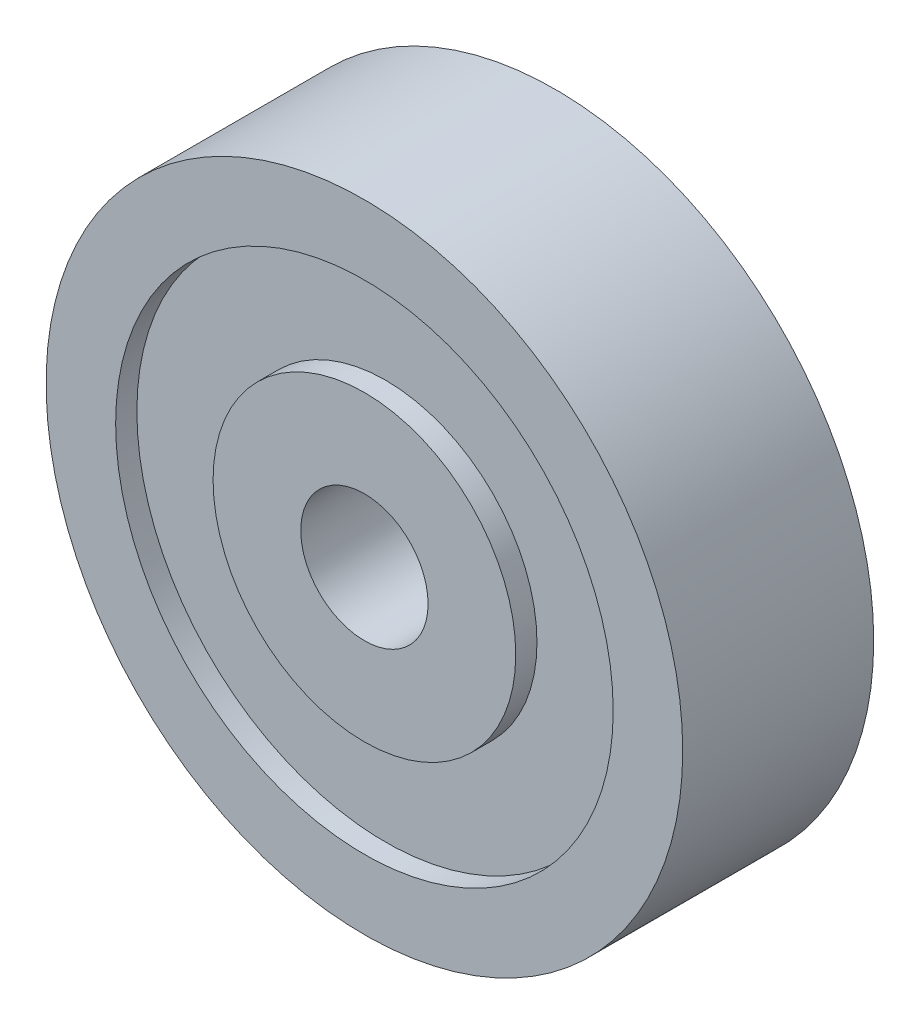
ISO-10303-21;
HEADER;
FILE_DESCRIPTION(('STEP AP214'),'2;1');
FILE_NAME('part.step','',(''),(''),'','','');
FILE_SCHEMA(('AUTOMOTIVE_DESIGN { 1 0 10303 214 1 1 1 1 }'));
ENDSEC;
DATA;
#1=APPLICATION_CONTEXT('core data for automotive mechanical design processes');
#2=APPLICATION_PROTOCOL_DEFINITION('international standard','automotive_design',2000,#1);
#3=PRODUCT_CONTEXT('',#1,'mechanical');
#4=PRODUCT('Part','Part','',(#3));
#5=PRODUCT_RELATED_PRODUCT_CATEGORY('part','',(#4));
#6=PRODUCT_DEFINITION_FORMATION('','',#4);
#7=PRODUCT_DEFINITION_CONTEXT('part definition',#1,'design');
#8=PRODUCT_DEFINITION('design','',#6,#7);
#9=PRODUCT_DEFINITION_SHAPE('','',#8);
#10=(LENGTH_UNIT() NAMED_UNIT(*) SI_UNIT(.MILLI.,.METRE.));
#11=(NAMED_UNIT(*) PLANE_ANGLE_UNIT() SI_UNIT($,.RADIAN.));
#12=(NAMED_UNIT(*) SI_UNIT($,.STERADIAN.) SOLID_ANGLE_UNIT());
#13=UNCERTAINTY_MEASURE_WITH_UNIT(LENGTH_MEASURE(1.E-05),#10,'distance_accuracy_value','');
#14=(GEOMETRIC_REPRESENTATION_CONTEXT(3) GLOBAL_UNCERTAINTY_ASSIGNED_CONTEXT((#13)) GLOBAL_UNIT_ASSIGNED_CONTEXT((#10,
#11,#12)) REPRESENTATION_CONTEXT('',''));
#15=CARTESIAN_POINT('',(0.,0.,0.));
#16=DIRECTION('',(0.,0.,1.));
#17=DIRECTION('',(1.,0.,0.));
#18=AXIS2_PLACEMENT_3D('',#15,#16,#17);
#19=CARTESIAN_POINT('',(0.,0.,9.));
#20=DIRECTION('',(0.,0.,1.));
#21=DIRECTION('',(1.,0.,0.));
#22=AXIS2_PLACEMENT_3D('',#19,#20,#21);
#23=PLANE('',#22);
#24=CARTESIAN_POINT('',(0.,0.,9.));
#25=DIRECTION('',(0.,0.,1.));
#26=DIRECTION('',(1.,0.,0.));
#27=AXIS2_PLACEMENT_3D('',#24,#25,#26);
#28=CIRCLE('',#27,3.);
#29=CARTESIAN_POINT('',(3.,0.,9.));
#30=VERTEX_POINT('',#29);
#31=EDGE_CURVE('E50',#30,#30,#28,.T.);
#32=ORIENTED_EDGE('',*,*,#31,.F.);
#33=EDGE_LOOP('',(#32));
#34=FACE_BOUND('',#33,.T.);
#35=CARTESIAN_POINT('',(0.,0.,9.));
#36=DIRECTION('',(0.,0.,-1.));
#37=DIRECTION('',(-1.,0.,0.));
#38=AXIS2_PLACEMENT_3D('',#35,#36,#37);
#39=CIRCLE('',#38,7.13156196506708);
#40=CARTESIAN_POINT('',(-7.13156196506708,0.,9.));
#41=VERTEX_POINT('',#40);
#42=EDGE_CURVE('E76',#41,#41,#39,.T.);
#43=ORIENTED_EDGE('',*,*,#42,.F.);
#44=EDGE_LOOP('',(#43));
#45=FACE_BOUND('',#44,.T.);
#46=ADVANCED_FACE('F39',(#34,#45),#23,.T.);
#47=CARTESIAN_POINT('',(0.,0.,0.));
#48=DIRECTION('',(0.,0.,1.));
#49=DIRECTION('',(1.,0.,0.));
#50=AXIS2_PLACEMENT_3D('',#47,#48,#49);
#51=PLANE('',#50);
#52=CARTESIAN_POINT('',(0.,0.,0.));
#53=DIRECTION('',(0.,0.,1.));
#54=DIRECTION('',(1.,0.,0.));
#55=AXIS2_PLACEMENT_3D('',#52,#53,#54);
#56=CIRCLE('',#55,3.);
#57=CARTESIAN_POINT('',(3.,0.,0.));
#58=VERTEX_POINT('',#57);
#59=EDGE_CURVE('E52',#58,#58,#56,.T.);
#60=ORIENTED_EDGE('',*,*,#59,.T.);
#61=EDGE_LOOP('',(#60));
#62=FACE_BOUND('',#61,.T.);
#63=CARTESIAN_POINT('',(0.,0.,0.));
#64=DIRECTION('',(0.,0.,-1.));
#65=DIRECTION('',(-1.,0.,0.));
#66=AXIS2_PLACEMENT_3D('',#63,#64,#65);
#67=CIRCLE('',#66,7.13156196506708);
#68=CARTESIAN_POINT('',(-7.13156196506708,0.,0.));
#69=VERTEX_POINT('',#68);
#70=EDGE_CURVE('E64',#69,#69,#67,.T.);
#71=ORIENTED_EDGE('',*,*,#70,.T.);
#72=EDGE_LOOP('',(#71));
#73=FACE_BOUND('',#72,.T.);
#74=ADVANCED_FACE('F92',(#62,#73),#51,.F.);
#75=CARTESIAN_POINT('',(0.,0.,9.));
#76=DIRECTION('',(0.,0.,-1.));
#77=DIRECTION('',(-1.,0.,0.));
#78=AXIS2_PLACEMENT_3D('',#75,#76,#77);
#79=CIRCLE('',#78,11.7231294362522);
#80=CARTESIAN_POINT('',(-11.7231294362522,0.,9.));
#81=VERTEX_POINT('',#80);
#82=EDGE_CURVE('E70',#81,#81,#79,.T.);
#83=ORIENTED_EDGE('',*,*,#82,.T.);
#84=EDGE_LOOP('',(#83));
#85=FACE_BOUND('',#84,.T.);
#86=CARTESIAN_POINT('',(0.,0.,9.));
#87=DIRECTION('',(0.,0.,1.));
#88=DIRECTION('',(1.,0.,0.));
#89=AXIS2_PLACEMENT_3D('',#86,#87,#88);
#90=CIRCLE('',#89,15.);
#91=CARTESIAN_POINT('',(15.,0.,9.));
#92=VERTEX_POINT('',#91);
#93=EDGE_CURVE('E10',#92,#92,#90,.T.);
#94=ORIENTED_EDGE('',*,*,#93,.T.);
#95=EDGE_LOOP('',(#94));
#96=FACE_BOUND('',#95,.T.);
#97=ADVANCED_FACE('F95',(#85,#96),#23,.T.);
#98=CARTESIAN_POINT('',(0.,0.,0.));
#99=DIRECTION('',(0.,0.,-1.));
#100=DIRECTION('',(-1.,0.,0.));
#101=AXIS2_PLACEMENT_3D('',#98,#99,#100);
#102=CIRCLE('',#101,11.7231294362522);
#103=CARTESIAN_POINT('',(-11.7231294362522,0.,0.));
#104=VERTEX_POINT('',#103);
#105=EDGE_CURVE('E58',#104,#104,#102,.T.);
#106=ORIENTED_EDGE('',*,*,#105,.F.);
#107=EDGE_LOOP('',(#106));
#108=FACE_BOUND('',#107,.T.);
#109=CARTESIAN_POINT('',(0.,0.,0.));
#110=DIRECTION('',(0.,0.,1.));
#111=DIRECTION('',(1.,0.,0.));
#112=AXIS2_PLACEMENT_3D('',#109,#110,#111);
#113=CIRCLE('',#112,15.);
#114=CARTESIAN_POINT('',(15.,0.,0.));
#115=VERTEX_POINT('',#114);
#116=EDGE_CURVE('E43',#115,#115,#113,.T.);
#117=ORIENTED_EDGE('',*,*,#116,.F.);
#118=EDGE_LOOP('',(#117));
#119=FACE_BOUND('',#118,.T.);
#120=ADVANCED_FACE('F102',(#108,#119),#51,.F.);
#121=CARTESIAN_POINT('',(0.,0.,9.));
#122=DIRECTION('',(0.,0.,-1.));
#123=DIRECTION('',(-1.,0.,0.));
#124=AXIS2_PLACEMENT_3D('',#121,#122,#123);
#125=CYLINDRICAL_SURFACE('',#124,15.);
#126=ORIENTED_EDGE('',*,*,#93,.F.);
#127=EDGE_LOOP('',(#126));
#128=FACE_BOUND('',#127,.T.);
#129=ORIENTED_EDGE('',*,*,#116,.T.);
#130=EDGE_LOOP('',(#129));
#131=FACE_BOUND('',#130,.T.);
#132=ADVANCED_FACE('F41',(#128,#131),#125,.T.);
#133=CARTESIAN_POINT('',(0.,0.,9.));
#134=DIRECTION('',(0.,0.,-1.));
#135=DIRECTION('',(-1.,0.,0.));
#136=AXIS2_PLACEMENT_3D('',#133,#134,#135);
#137=CYLINDRICAL_SURFACE('',#136,3.);
#138=ORIENTED_EDGE('',*,*,#31,.T.);
#139=EDGE_LOOP('',(#138));
#140=FACE_BOUND('',#139,.T.);
#141=ORIENTED_EDGE('',*,*,#59,.F.);
#142=EDGE_LOOP('',(#141));
#143=FACE_BOUND('',#142,.T.);
#144=ADVANCED_FACE('F130',(#140,#143),#137,.F.);
#145=CARTESIAN_POINT('',(0.,0.,1.));
#146=DIRECTION('',(0.,0.,-1.));
#147=DIRECTION('',(-1.,0.,0.));
#148=AXIS2_PLACEMENT_3D('',#145,#146,#147);
#149=CYLINDRICAL_SURFACE('',#148,11.7231294362522);
#150=CARTESIAN_POINT('',(0.,0.,1.));
#151=DIRECTION('',(0.,0.,-1.));
#152=DIRECTION('',(-1.,0.,0.));
#153=AXIS2_PLACEMENT_3D('',#150,#151,#152);
#154=CIRCLE('',#153,11.7231294362522);
#155=CARTESIAN_POINT('',(-11.7231294362522,0.,1.));
#156=VERTEX_POINT('',#155);
#157=EDGE_CURVE('E55',#156,#156,#154,.T.);
#158=ORIENTED_EDGE('',*,*,#157,.F.);
#159=EDGE_LOOP('',(#158));
#160=FACE_BOUND('',#159,.T.);
#161=ORIENTED_EDGE('',*,*,#105,.T.);
#162=EDGE_LOOP('',(#161));
#163=FACE_BOUND('',#162,.T.);
#164=ADVANCED_FACE('F127',(#160,#163),#149,.F.);
#165=CARTESIAN_POINT('',(0.,0.,1.));
#166=DIRECTION('',(0.,0.,-1.));
#167=DIRECTION('',(-1.,0.,0.));
#168=AXIS2_PLACEMENT_3D('',#165,#166,#167);
#169=PLANE('',#168);
#170=CARTESIAN_POINT('',(0.,0.,1.));
#171=DIRECTION('',(0.,0.,-1.));
#172=DIRECTION('',(-1.,0.,0.));
#173=AXIS2_PLACEMENT_3D('',#170,#171,#172);
#174=CIRCLE('',#173,7.13156196506708);
#175=CARTESIAN_POINT('',(-7.13156196506708,0.,1.));
#176=VERTEX_POINT('',#175);
#177=EDGE_CURVE('E61',#176,#176,#174,.T.);
#178=ORIENTED_EDGE('',*,*,#177,.F.);
#179=EDGE_LOOP('',(#178));
#180=FACE_BOUND('',#179,.T.);
#181=ORIENTED_EDGE('',*,*,#157,.T.);
#182=EDGE_LOOP('',(#181));
#183=FACE_BOUND('',#182,.T.);
#184=ADVANCED_FACE('F123',(#180,#183),#169,.T.);
#185=CARTESIAN_POINT('',(0.,0.,1.));
#186=DIRECTION('',(0.,0.,-1.));
#187=DIRECTION('',(-1.,0.,0.));
#188=AXIS2_PLACEMENT_3D('',#185,#186,#187);
#189=CYLINDRICAL_SURFACE('',#188,7.13156196506708);
#190=ORIENTED_EDGE('',*,*,#177,.T.);
#191=EDGE_LOOP('',(#190));
#192=FACE_BOUND('',#191,.T.);
#193=ORIENTED_EDGE('',*,*,#70,.F.);
#194=EDGE_LOOP('',(#193));
#195=FACE_BOUND('',#194,.T.);
#196=ADVANCED_FACE('F118',(#192,#195),#189,.T.);
#197=CARTESIAN_POINT('',(0.,0.,8.));
#198=DIRECTION('',(0.,0.,1.));
#199=DIRECTION('',(-1.,0.,0.));
#200=AXIS2_PLACEMENT_3D('',#197,#198,#199);
#201=PLANE('',#200);
#202=CARTESIAN_POINT('',(0.,0.,8.));
#203=DIRECTION('',(0.,0.,-1.));
#204=DIRECTION('',(-1.,0.,0.));
#205=AXIS2_PLACEMENT_3D('',#202,#203,#204);
#206=CIRCLE('',#205,11.7231294362522);
#207=CARTESIAN_POINT('',(-11.7231294362522,0.,8.));
#208=VERTEX_POINT('',#207);
#209=EDGE_CURVE('E67',#208,#208,#206,.T.);
#210=ORIENTED_EDGE('',*,*,#209,.F.);
#211=EDGE_LOOP('',(#210));
#212=FACE_BOUND('',#211,.T.);
#213=CARTESIAN_POINT('',(0.,0.,8.));
#214=DIRECTION('',(0.,0.,-1.));
#215=DIRECTION('',(-1.,0.,0.));
#216=AXIS2_PLACEMENT_3D('',#213,#214,#215);
#217=CIRCLE('',#216,7.13156196506708);
#218=CARTESIAN_POINT('',(-7.13156196506708,0.,8.));
#219=VERTEX_POINT('',#218);
#220=EDGE_CURVE('E73',#219,#219,#217,.T.);
#221=ORIENTED_EDGE('',*,*,#220,.T.);
#222=EDGE_LOOP('',(#221));
#223=FACE_BOUND('',#222,.T.);
#224=ADVANCED_FACE('F82',(#212,#223),#201,.T.);
#225=CARTESIAN_POINT('',(0.,0.,8.));
#226=DIRECTION('',(0.,0.,1.));
#227=DIRECTION('',(1.,0.,0.));
#228=AXIS2_PLACEMENT_3D('',#225,#226,#227);
#229=CYLINDRICAL_SURFACE('',#228,11.7231294362522);
#230=ORIENTED_EDGE('',*,*,#209,.T.);
#231=EDGE_LOOP('',(#230));
#232=FACE_BOUND('',#231,.T.);
#233=ORIENTED_EDGE('',*,*,#82,.F.);
#234=EDGE_LOOP('',(#233));
#235=FACE_BOUND('',#234,.T.);
#236=ADVANCED_FACE('F87',(#232,#235),#229,.F.);
#237=CARTESIAN_POINT('',(0.,0.,8.));
#238=DIRECTION('',(0.,0.,1.));
#239=DIRECTION('',(1.,0.,0.));
#240=AXIS2_PLACEMENT_3D('',#237,#238,#239);
#241=CYLINDRICAL_SURFACE('',#240,7.13156196506708);
#242=ORIENTED_EDGE('',*,*,#220,.F.);
#243=EDGE_LOOP('',(#242));
#244=FACE_BOUND('',#243,.T.);
#245=ORIENTED_EDGE('',*,*,#42,.T.);
#246=EDGE_LOOP('',(#245));
#247=FACE_BOUND('',#246,.T.);
#248=ADVANCED_FACE('F84',(#244,#247),#241,.T.);
#249=CLOSED_SHELL('',(#46,#74,#97,#120,#132,#144,#164,#184,#196,#224,#236,#248));
#250=MANIFOLD_SOLID_BREP('B2',#249);
#251=ADVANCED_BREP_SHAPE_REPRESENTATION('',(#18,#250),#14);
#252=SHAPE_DEFINITION_REPRESENTATION(#9,#251);
ENDSEC;
END-ISO-10303-21;
